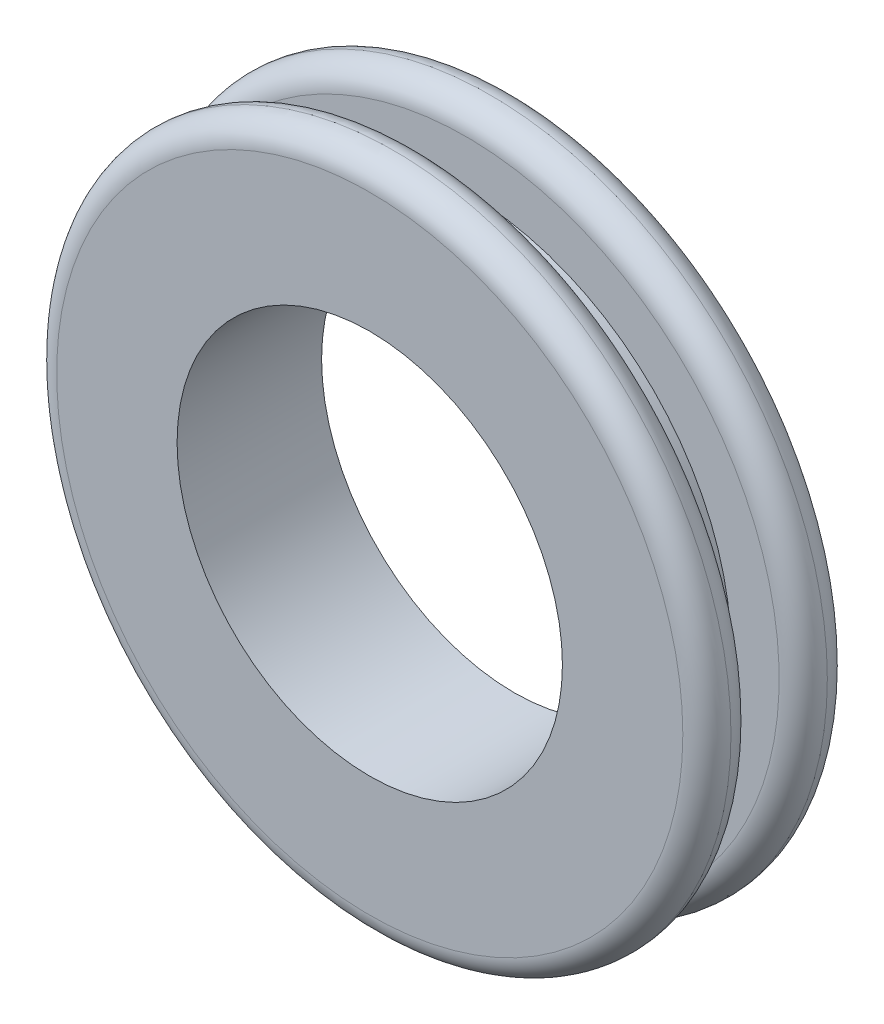
ISO-10303-21;
HEADER;
FILE_DESCRIPTION(('STEP AP214'),'2;1');
FILE_NAME('part.step','',(''),(''),'','','');
FILE_SCHEMA(('AUTOMOTIVE_DESIGN { 1 0 10303 214 1 1 1 1 }'));
ENDSEC;
DATA;
#1=APPLICATION_CONTEXT('core data for automotive mechanical design processes');
#2=APPLICATION_PROTOCOL_DEFINITION('international standard','automotive_design',2000,#1);
#3=PRODUCT_CONTEXT('',#1,'mechanical');
#4=PRODUCT('Part','Part','',(#3));
#5=PRODUCT_RELATED_PRODUCT_CATEGORY('part','',(#4));
#6=PRODUCT_DEFINITION_FORMATION('','',#4);
#7=PRODUCT_DEFINITION_CONTEXT('part definition',#1,'design');
#8=PRODUCT_DEFINITION('design','',#6,#7);
#9=PRODUCT_DEFINITION_SHAPE('','',#8);
#10=(LENGTH_UNIT() NAMED_UNIT(*) SI_UNIT(.MILLI.,.METRE.));
#11=(NAMED_UNIT(*) PLANE_ANGLE_UNIT() SI_UNIT($,.RADIAN.));
#12=(NAMED_UNIT(*) SI_UNIT($,.STERADIAN.) SOLID_ANGLE_UNIT());
#13=UNCERTAINTY_MEASURE_WITH_UNIT(LENGTH_MEASURE(1.E-05),#10,'distance_accuracy_value','');
#14=(GEOMETRIC_REPRESENTATION_CONTEXT(3) GLOBAL_UNCERTAINTY_ASSIGNED_CONTEXT((#13)) GLOBAL_UNIT_ASSIGNED_CONTEXT((#10,
#11,#12)) REPRESENTATION_CONTEXT('',''));
#15=CARTESIAN_POINT('',(0.,0.,0.));
#16=DIRECTION('',(0.,0.,1.));
#17=DIRECTION('',(1.,0.,0.));
#18=AXIS2_PLACEMENT_3D('',#15,#16,#17);
#19=CARTESIAN_POINT('',(0.,0.,3.));
#20=DIRECTION('',(0.,0.,1.));
#21=DIRECTION('',(1.,0.,0.));
#22=AXIS2_PLACEMENT_3D('',#19,#20,#21);
#23=PLANE('',#22);
#24=CARTESIAN_POINT('',(0.,0.,3.));
#25=DIRECTION('',(0.,0.,1.));
#26=DIRECTION('',(1.,0.,0.));
#27=AXIS2_PLACEMENT_3D('',#24,#25,#26);
#28=CIRCLE('',#27,6.5);
#29=CARTESIAN_POINT('',(6.5,0.,3.));
#30=VERTEX_POINT('',#29);
#31=EDGE_CURVE('E10',#30,#30,#28,.T.);
#32=ORIENTED_EDGE('',*,*,#31,.T.);
#33=EDGE_LOOP('',(#32));
#34=FACE_BOUND('',#33,.T.);
#35=CARTESIAN_POINT('',(0.,0.,3.));
#36=DIRECTION('',(0.,0.,1.));
#37=DIRECTION('',(1.,0.,0.));
#38=AXIS2_PLACEMENT_3D('',#35,#36,#37);
#39=CIRCLE('',#38,4.);
#40=CARTESIAN_POINT('',(4.,0.,3.));
#41=VERTEX_POINT('',#40);
#42=EDGE_CURVE('E119',#41,#41,#39,.T.);
#43=ORIENTED_EDGE('',*,*,#42,.F.);
#44=EDGE_LOOP('',(#43));
#45=FACE_BOUND('',#44,.T.);
#46=ADVANCED_FACE('F32',(#34,#45),#23,.T.);
#47=CARTESIAN_POINT('',(0.,0.,0.));
#48=DIRECTION('',(0.,0.,1.));
#49=DIRECTION('',(1.,0.,0.));
#50=AXIS2_PLACEMENT_3D('',#47,#48,#49);
#51=PLANE('',#50);
#52=CARTESIAN_POINT('',(0.,0.,0.));
#53=DIRECTION('',(0.,0.,1.));
#54=DIRECTION('',(1.,0.,0.));
#55=AXIS2_PLACEMENT_3D('',#52,#53,#54);
#56=CIRCLE('',#55,6.5);
#57=CARTESIAN_POINT('',(6.5,0.,0.));
#58=VERTEX_POINT('',#57);
#59=EDGE_CURVE('E40',#58,#58,#56,.F.);
#60=ORIENTED_EDGE('',*,*,#59,.T.);
#61=EDGE_LOOP('',(#60));
#62=FACE_BOUND('',#61,.T.);
#63=CARTESIAN_POINT('',(0.,0.,0.));
#64=DIRECTION('',(0.,0.,1.));
#65=DIRECTION('',(1.,0.,0.));
#66=AXIS2_PLACEMENT_3D('',#63,#64,#65);
#67=CIRCLE('',#66,4.);
#68=CARTESIAN_POINT('',(4.,0.,0.));
#69=VERTEX_POINT('',#68);
#70=EDGE_CURVE('E116',#69,#69,#67,.T.);
#71=ORIENTED_EDGE('',*,*,#70,.T.);
#72=EDGE_LOOP('',(#71));
#73=FACE_BOUND('',#72,.T.);
#74=ADVANCED_FACE('F73',(#62,#73),#51,.F.);
#75=CARTESIAN_POINT('',(0.,0.,3.));
#76=DIRECTION('',(0.,0.,-1.));
#77=DIRECTION('',(-1.,0.,0.));
#78=AXIS2_PLACEMENT_3D('',#75,#76,#77);
#79=CYLINDRICAL_SURFACE('',#78,4.);
#80=ORIENTED_EDGE('',*,*,#42,.T.);
#81=EDGE_LOOP('',(#80));
#82=FACE_BOUND('',#81,.T.);
#83=ORIENTED_EDGE('',*,*,#70,.F.);
#84=EDGE_LOOP('',(#83));
#85=FACE_BOUND('',#84,.T.);
#86=ADVANCED_FACE('F78',(#82,#85),#79,.F.);
#87=CARTESIAN_POINT('',(0.,7.,2.));
#88=DIRECTION('',(0.,0.,1.));
#89=DIRECTION('',(1.,0.,0.));
#90=AXIS2_PLACEMENT_3D('',#87,#88,#89);
#91=PLANE('',#90);
#92=CARTESIAN_POINT('',(0.,0.,2.));
#93=DIRECTION('',(0.,0.,1.));
#94=DIRECTION('',(1.,0.,0.));
#95=AXIS2_PLACEMENT_3D('',#92,#93,#94);
#96=CIRCLE('',#95,6.5);
#97=CARTESIAN_POINT('',(6.5,0.,2.));
#98=VERTEX_POINT('',#97);
#99=EDGE_CURVE('E112',#98,#98,#96,.F.);
#100=ORIENTED_EDGE('',*,*,#99,.T.);
#101=EDGE_LOOP('',(#100));
#102=FACE_BOUND('',#101,.T.);
#103=CARTESIAN_POINT('',(0.,0.,2.));
#104=DIRECTION('',(0.,0.,-1.));
#105=DIRECTION('',(-1.,0.,0.));
#106=AXIS2_PLACEMENT_3D('',#103,#104,#105);
#107=CIRCLE('',#106,5.5);
#108=CARTESIAN_POINT('',(-5.5,0.,2.));
#109=VERTEX_POINT('',#108);
#110=EDGE_CURVE('E54',#109,#109,#107,.T.);
#111=ORIENTED_EDGE('',*,*,#110,.F.);
#112=EDGE_LOOP('',(#111));
#113=FACE_BOUND('',#112,.T.);
#114=ADVANCED_FACE('F98',(#102,#113),#91,.F.);
#115=CARTESIAN_POINT('',(0.,0.,-1.51087421062077));
#116=DIRECTION('',(0.,0.,-1.));
#117=DIRECTION('',(-1.,0.,0.));
#118=AXIS2_PLACEMENT_3D('',#115,#116,#117);
#119=CYLINDRICAL_SURFACE('',#118,5.5);
#120=CARTESIAN_POINT('',(0.,0.,0.999999999999999));
#121=DIRECTION('',(0.,0.,-1.));
#122=DIRECTION('',(-1.,0.,0.));
#123=AXIS2_PLACEMENT_3D('',#120,#121,#122);
#124=CIRCLE('',#123,5.5);
#125=CARTESIAN_POINT('',(-5.5,0.,0.999999999999999));
#126=VERTEX_POINT('',#125);
#127=EDGE_CURVE('E50',#126,#126,#124,.T.);
#128=ORIENTED_EDGE('',*,*,#127,.F.);
#129=EDGE_LOOP('',(#128));
#130=FACE_BOUND('',#129,.T.);
#131=ORIENTED_EDGE('',*,*,#110,.T.);
#132=EDGE_LOOP('',(#131));
#133=FACE_BOUND('',#132,.T.);
#134=ADVANCED_FACE('F91',(#130,#133),#119,.T.);
#135=CARTESIAN_POINT('',(0.,7.,0.999999999999999));
#136=DIRECTION('',(0.,0.,-1.));
#137=DIRECTION('',(-1.,0.,0.));
#138=AXIS2_PLACEMENT_3D('',#135,#136,#137);
#139=PLANE('',#138);
#140=CARTESIAN_POINT('',(0.,0.,0.999999999999999));
#141=DIRECTION('',(0.,0.,-1.));
#142=DIRECTION('',(-1.,0.,0.));
#143=AXIS2_PLACEMENT_3D('',#140,#141,#142);
#144=CIRCLE('',#143,6.5);
#145=CARTESIAN_POINT('',(-6.5,0.,0.999999999999999));
#146=VERTEX_POINT('',#145);
#147=EDGE_CURVE('E45',#146,#146,#144,.F.);
#148=ORIENTED_EDGE('',*,*,#147,.T.);
#149=EDGE_LOOP('',(#148));
#150=FACE_BOUND('',#149,.T.);
#151=ORIENTED_EDGE('',*,*,#127,.T.);
#152=EDGE_LOOP('',(#151));
#153=FACE_BOUND('',#152,.T.);
#154=ADVANCED_FACE('F86',(#150,#153),#139,.F.);
#155=CARTESIAN_POINT('',(0.,0.,2.5));
#156=DIRECTION('',(0.,0.,1.));
#157=DIRECTION('',(1.,0.,0.));
#158=AXIS2_PLACEMENT_3D('',#155,#156,#157);
#159=TOROIDAL_SURFACE('',#158,6.5,0.5);
#160=ORIENTED_EDGE('',*,*,#31,.F.);
#161=EDGE_LOOP('',(#160));
#162=FACE_BOUND('',#161,.T.);
#163=CARTESIAN_POINT('',(0.,0.,2.5));
#164=DIRECTION('',(0.,0.,1.));
#165=DIRECTION('',(1.,0.,0.));
#166=AXIS2_PLACEMENT_3D('',#163,#164,#165);
#167=CIRCLE('',#166,7.);
#168=CARTESIAN_POINT('',(7.,0.,2.5));
#169=VERTEX_POINT('',#168);
#170=EDGE_CURVE('E48',#169,#169,#167,.F.);
#171=ORIENTED_EDGE('',*,*,#170,.F.);
#172=EDGE_LOOP('',(#171));
#173=FACE_BOUND('',#172,.T.);
#174=ADVANCED_FACE('F69',(#162,#173),#159,.T.);
#175=CARTESIAN_POINT('',(0.,0.,2.5));
#176=DIRECTION('',(0.,0.,1.));
#177=DIRECTION('',(1.,0.,0.));
#178=AXIS2_PLACEMENT_3D('',#175,#176,#177);
#179=TOROIDAL_SURFACE('',#178,6.5,0.5);
#180=ORIENTED_EDGE('',*,*,#170,.T.);
#181=EDGE_LOOP('',(#180));
#182=FACE_BOUND('',#181,.T.);
#183=ORIENTED_EDGE('',*,*,#99,.F.);
#184=EDGE_LOOP('',(#183));
#185=FACE_BOUND('',#184,.T.);
#186=ADVANCED_FACE('F62',(#182,#185),#179,.T.);
#187=CARTESIAN_POINT('',(0.,0.,0.5));
#188=DIRECTION('',(0.,0.,1.));
#189=DIRECTION('',(1.,0.,0.));
#190=AXIS2_PLACEMENT_3D('',#187,#188,#189);
#191=TOROIDAL_SURFACE('',#190,6.5,0.5);
#192=ORIENTED_EDGE('',*,*,#59,.F.);
#193=EDGE_LOOP('',(#192));
#194=FACE_BOUND('',#193,.T.);
#195=CARTESIAN_POINT('',(0.,0.,0.5));
#196=DIRECTION('',(0.,0.,1.));
#197=DIRECTION('',(1.,0.,0.));
#198=AXIS2_PLACEMENT_3D('',#195,#196,#197);
#199=CIRCLE('',#198,7.);
#200=CARTESIAN_POINT('',(7.,0.,0.5));
#201=VERTEX_POINT('',#200);
#202=EDGE_CURVE('E36',#201,#201,#199,.T.);
#203=ORIENTED_EDGE('',*,*,#202,.F.);
#204=EDGE_LOOP('',(#203));
#205=FACE_BOUND('',#204,.T.);
#206=ADVANCED_FACE('F34',(#194,#205),#191,.T.);
#207=CARTESIAN_POINT('',(0.,0.,0.5));
#208=DIRECTION('',(0.,0.,-1.));
#209=DIRECTION('',(-1.,0.,0.));
#210=AXIS2_PLACEMENT_3D('',#207,#208,#209);
#211=TOROIDAL_SURFACE('',#210,6.5,0.5);
#212=ORIENTED_EDGE('',*,*,#147,.F.);
#213=EDGE_LOOP('',(#212));
#214=FACE_BOUND('',#213,.T.);
#215=ORIENTED_EDGE('',*,*,#202,.T.);
#216=EDGE_LOOP('',(#215));
#217=FACE_BOUND('',#216,.T.);
#218=ADVANCED_FACE('F59',(#214,#217),#211,.T.);
#219=CLOSED_SHELL('',(#46,#74,#86,#114,#134,#154,#174,#186,#206,#218));
#220=MANIFOLD_SOLID_BREP('B2',#219);
#221=ADVANCED_BREP_SHAPE_REPRESENTATION('',(#18,#220),#14);
#222=SHAPE_DEFINITION_REPRESENTATION(#9,#221);
ENDSEC;
END-ISO-10303-21;
